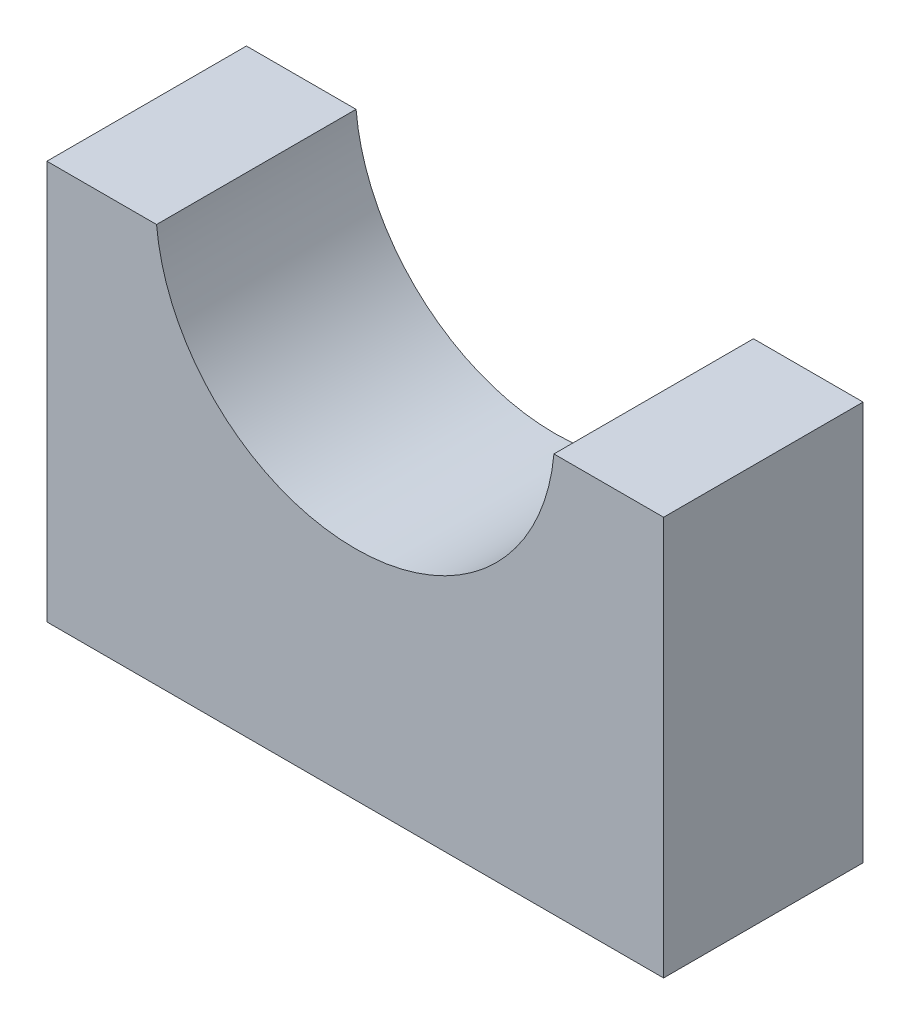
ISO-10303-21;
HEADER;
FILE_DESCRIPTION(('STEP AP214'),'2;1');
FILE_NAME('part.step','',(''),(''),'','','');
FILE_SCHEMA(('AUTOMOTIVE_DESIGN { 1 0 10303 214 1 1 1 1 }'));
ENDSEC;
DATA;
#1=APPLICATION_CONTEXT('core data for automotive mechanical design processes');
#2=APPLICATION_PROTOCOL_DEFINITION('international standard','automotive_design',2000,#1);
#3=PRODUCT_CONTEXT('',#1,'mechanical');
#4=PRODUCT('Part','Part','',(#3));
#5=PRODUCT_RELATED_PRODUCT_CATEGORY('part','',(#4));
#6=PRODUCT_DEFINITION_FORMATION('','',#4);
#7=PRODUCT_DEFINITION_CONTEXT('part definition',#1,'design');
#8=PRODUCT_DEFINITION('design','',#6,#7);
#9=PRODUCT_DEFINITION_SHAPE('','',#8);
#10=(LENGTH_UNIT() NAMED_UNIT(*) SI_UNIT(.MILLI.,.METRE.));
#11=(NAMED_UNIT(*) PLANE_ANGLE_UNIT() SI_UNIT($,.RADIAN.));
#12=(NAMED_UNIT(*) SI_UNIT($,.STERADIAN.) SOLID_ANGLE_UNIT());
#13=UNCERTAINTY_MEASURE_WITH_UNIT(LENGTH_MEASURE(1.E-05),#10,'distance_accuracy_value','');
#14=(GEOMETRIC_REPRESENTATION_CONTEXT(3) GLOBAL_UNCERTAINTY_ASSIGNED_CONTEXT((#13)) GLOBAL_UNIT_ASSIGNED_CONTEXT((#10,
#11,#12)) REPRESENTATION_CONTEXT('',''));
#15=CARTESIAN_POINT('',(0.,0.,0.));
#16=DIRECTION('',(0.,0.,1.));
#17=DIRECTION('',(1.,0.,0.));
#18=AXIS2_PLACEMENT_3D('',#15,#16,#17);
#19=CARTESIAN_POINT('',(0.,0.,11.));
#20=DIRECTION('',(0.,0.,-1.));
#21=DIRECTION('',(-1.,0.,0.));
#22=AXIS2_PLACEMENT_3D('',#19,#20,#21);
#23=CYLINDRICAL_SURFACE('',#22,11.);
#24=CARTESIAN_POINT('',(0.,0.,0.));
#25=DIRECTION('',(0.,0.,1.));
#26=DIRECTION('',(1.,0.,0.));
#27=AXIS2_PLACEMENT_3D('',#24,#25,#26);
#28=CIRCLE('',#27,11.);
#29=CARTESIAN_POINT('',(-10.9544511501033,-1.,0.));
#30=VERTEX_POINT('',#29);
#31=CARTESIAN_POINT('',(10.9544511501033,-1.,0.));
#32=VERTEX_POINT('',#31);
#33=EDGE_CURVE('E118',#30,#32,#28,.T.);
#34=ORIENTED_EDGE('',*,*,#33,.F.);
#35=DIRECTION('',(0.,0.,-1.));
#36=VECTOR('',#35,1.);
#37=CARTESIAN_POINT('',(-10.9544511501033,-1.,11.));
#38=LINE('',#37,#36);
#39=CARTESIAN_POINT('',(-10.9544511501033,-1.,11.));
#40=VERTEX_POINT('',#39);
#41=EDGE_CURVE('E11',#40,#30,#38,.T.);
#42=ORIENTED_EDGE('',*,*,#41,.F.);
#43=CARTESIAN_POINT('',(0.,0.,11.));
#44=DIRECTION('',(0.,0.,1.));
#45=DIRECTION('',(1.,0.,0.));
#46=AXIS2_PLACEMENT_3D('',#43,#44,#45);
#47=CIRCLE('',#46,11.);
#48=CARTESIAN_POINT('',(10.9544511501033,-1.,11.));
#49=VERTEX_POINT('',#48);
#50=EDGE_CURVE('E142',#40,#49,#47,.T.);
#51=ORIENTED_EDGE('',*,*,#50,.T.);
#52=DIRECTION('',(0.,0.,-1.));
#53=VECTOR('',#52,1.);
#54=CARTESIAN_POINT('',(10.9544511501033,-1.,11.));
#55=LINE('',#54,#53);
#56=EDGE_CURVE('E51',#49,#32,#55,.T.);
#57=ORIENTED_EDGE('',*,*,#56,.T.);
#58=EDGE_LOOP('',(#34,#42,#51,#57));
#59=FACE_BOUND('',#58,.T.);
#60=ADVANCED_FACE('F35',(#59),#23,.F.);
#61=CARTESIAN_POINT('',(0.,-1.,11.));
#62=DIRECTION('',(0.,1.,0.));
#63=DIRECTION('',(0.,0.,1.));
#64=AXIS2_PLACEMENT_3D('',#61,#62,#63);
#65=PLANE('',#64);
#66=DIRECTION('',(1.,0.,0.));
#67=VECTOR('',#66,1.);
#68=CARTESIAN_POINT('',(0.,-1.,0.));
#69=LINE('',#68,#67);
#70=CARTESIAN_POINT('',(-17.,-1.,0.));
#71=VERTEX_POINT('',#70);
#72=EDGE_CURVE('E120',#71,#30,#69,.T.);
#73=ORIENTED_EDGE('',*,*,#72,.F.);
#74=DIRECTION('',(0.,0.,-1.));
#75=VECTOR('',#74,1.);
#76=CARTESIAN_POINT('',(-17.,-1.,11.));
#77=LINE('',#76,#75);
#78=CARTESIAN_POINT('',(-17.,-1.,11.));
#79=VERTEX_POINT('',#78);
#80=EDGE_CURVE('E43',#79,#71,#77,.T.);
#81=ORIENTED_EDGE('',*,*,#80,.F.);
#82=DIRECTION('',(1.,0.,0.));
#83=VECTOR('',#82,1.);
#84=CARTESIAN_POINT('',(0.,-1.,11.));
#85=LINE('',#84,#83);
#86=EDGE_CURVE('E115',#79,#40,#85,.T.);
#87=ORIENTED_EDGE('',*,*,#86,.T.);
#88=ORIENTED_EDGE('',*,*,#41,.T.);
#89=EDGE_LOOP('',(#73,#81,#87,#88));
#90=FACE_BOUND('',#89,.T.);
#91=ADVANCED_FACE('F139',(#90),#65,.T.);
#92=CARTESIAN_POINT('',(-17.,0.,11.));
#93=DIRECTION('',(1.,0.,0.));
#94=DIRECTION('',(0.,1.,0.));
#95=AXIS2_PLACEMENT_3D('',#92,#93,#94);
#96=PLANE('',#95);
#97=DIRECTION('',(0.,-1.,0.));
#98=VECTOR('',#97,1.);
#99=CARTESIAN_POINT('',(-17.,0.,0.));
#100=LINE('',#99,#98);
#101=CARTESIAN_POINT('',(-17.,-23.,0.));
#102=VERTEX_POINT('',#101);
#103=EDGE_CURVE('E123',#71,#102,#100,.T.);
#104=ORIENTED_EDGE('',*,*,#103,.T.);
#105=DIRECTION('',(0.,0.,-1.));
#106=VECTOR('',#105,1.);
#107=CARTESIAN_POINT('',(-17.,-23.,11.));
#108=LINE('',#107,#106);
#109=CARTESIAN_POINT('',(-17.,-23.,11.));
#110=VERTEX_POINT('',#109);
#111=EDGE_CURVE('E109',#110,#102,#108,.T.);
#112=ORIENTED_EDGE('',*,*,#111,.F.);
#113=DIRECTION('',(0.,-1.,0.));
#114=VECTOR('',#113,1.);
#115=CARTESIAN_POINT('',(-17.,0.,11.));
#116=LINE('',#115,#114);
#117=EDGE_CURVE('E97',#79,#110,#116,.T.);
#118=ORIENTED_EDGE('',*,*,#117,.F.);
#119=ORIENTED_EDGE('',*,*,#80,.T.);
#120=EDGE_LOOP('',(#104,#112,#118,#119));
#121=FACE_BOUND('',#120,.T.);
#122=ADVANCED_FACE('F133',(#121),#96,.F.);
#123=CARTESIAN_POINT('',(0.,-23.,11.));
#124=DIRECTION('',(0.,1.,0.));
#125=DIRECTION('',(-1.,0.,0.));
#126=AXIS2_PLACEMENT_3D('',#123,#124,#125);
#127=PLANE('',#126);
#128=DIRECTION('',(1.,0.,0.));
#129=VECTOR('',#128,1.);
#130=CARTESIAN_POINT('',(0.,-23.,0.));
#131=LINE('',#130,#129);
#132=CARTESIAN_POINT('',(17.,-23.,0.));
#133=VERTEX_POINT('',#132);
#134=EDGE_CURVE('E106',#102,#133,#131,.T.);
#135=ORIENTED_EDGE('',*,*,#134,.T.);
#136=DIRECTION('',(0.,0.,-1.));
#137=VECTOR('',#136,1.);
#138=CARTESIAN_POINT('',(17.,-23.,11.));
#139=LINE('',#138,#137);
#140=CARTESIAN_POINT('',(17.,-23.,11.));
#141=VERTEX_POINT('',#140);
#142=EDGE_CURVE('E103',#141,#133,#139,.T.);
#143=ORIENTED_EDGE('',*,*,#142,.F.);
#144=DIRECTION('',(1.,0.,0.));
#145=VECTOR('',#144,1.);
#146=CARTESIAN_POINT('',(0.,-23.,11.));
#147=LINE('',#146,#145);
#148=EDGE_CURVE('E89',#110,#141,#147,.T.);
#149=ORIENTED_EDGE('',*,*,#148,.F.);
#150=ORIENTED_EDGE('',*,*,#111,.T.);
#151=EDGE_LOOP('',(#135,#143,#149,#150));
#152=FACE_BOUND('',#151,.T.);
#153=ADVANCED_FACE('F104',(#152),#127,.F.);
#154=CARTESIAN_POINT('',(17.,0.,11.));
#155=DIRECTION('',(-1.,0.,0.));
#156=DIRECTION('',(0.,0.,1.));
#157=AXIS2_PLACEMENT_3D('',#154,#155,#156);
#158=PLANE('',#157);
#159=DIRECTION('',(0.,1.,0.));
#160=VECTOR('',#159,1.);
#161=CARTESIAN_POINT('',(17.,0.,0.));
#162=LINE('',#161,#160);
#163=CARTESIAN_POINT('',(17.,-1.,0.));
#164=VERTEX_POINT('',#163);
#165=EDGE_CURVE('E127',#133,#164,#162,.T.);
#166=ORIENTED_EDGE('',*,*,#165,.T.);
#167=DIRECTION('',(0.,0.,-1.));
#168=VECTOR('',#167,1.);
#169=CARTESIAN_POINT('',(17.,-1.,11.));
#170=LINE('',#169,#168);
#171=CARTESIAN_POINT('',(17.,-1.,11.));
#172=VERTEX_POINT('',#171);
#173=EDGE_CURVE('E71',#172,#164,#170,.T.);
#174=ORIENTED_EDGE('',*,*,#173,.F.);
#175=DIRECTION('',(0.,1.,0.));
#176=VECTOR('',#175,1.);
#177=CARTESIAN_POINT('',(17.,0.,11.));
#178=LINE('',#177,#176);
#179=EDGE_CURVE('E94',#141,#172,#178,.T.);
#180=ORIENTED_EDGE('',*,*,#179,.F.);
#181=ORIENTED_EDGE('',*,*,#142,.T.);
#182=EDGE_LOOP('',(#166,#174,#180,#181));
#183=FACE_BOUND('',#182,.T.);
#184=ADVANCED_FACE('F111',(#183),#158,.F.);
#185=EDGE_CURVE('E124',#32,#164,#69,.T.);
#186=ORIENTED_EDGE('',*,*,#185,.F.);
#187=ORIENTED_EDGE('',*,*,#56,.F.);
#188=EDGE_CURVE('E112',#49,#172,#85,.T.);
#189=ORIENTED_EDGE('',*,*,#188,.T.);
#190=ORIENTED_EDGE('',*,*,#173,.T.);
#191=EDGE_LOOP('',(#186,#187,#189,#190));
#192=FACE_BOUND('',#191,.T.);
#193=ADVANCED_FACE('F141',(#192),#65,.T.);
#194=CARTESIAN_POINT('',(0.,0.,11.));
#195=DIRECTION('',(0.,0.,1.));
#196=DIRECTION('',(1.,0.,0.));
#197=AXIS2_PLACEMENT_3D('',#194,#195,#196);
#198=PLANE('',#197);
#199=ORIENTED_EDGE('',*,*,#50,.F.);
#200=ORIENTED_EDGE('',*,*,#86,.F.);
#201=ORIENTED_EDGE('',*,*,#117,.T.);
#202=ORIENTED_EDGE('',*,*,#148,.T.);
#203=ORIENTED_EDGE('',*,*,#179,.T.);
#204=ORIENTED_EDGE('',*,*,#188,.F.);
#205=EDGE_LOOP('',(#199,#200,#201,#202,#203,#204));
#206=FACE_BOUND('',#205,.T.);
#207=ADVANCED_FACE('F91',(#206),#198,.T.);
#208=CARTESIAN_POINT('',(0.,0.,0.));
#209=DIRECTION('',(0.,0.,1.));
#210=DIRECTION('',(1.,0.,0.));
#211=AXIS2_PLACEMENT_3D('',#208,#209,#210);
#212=PLANE('',#211);
#213=ORIENTED_EDGE('',*,*,#33,.T.);
#214=ORIENTED_EDGE('',*,*,#185,.T.);
#215=ORIENTED_EDGE('',*,*,#165,.F.);
#216=ORIENTED_EDGE('',*,*,#134,.F.);
#217=ORIENTED_EDGE('',*,*,#103,.F.);
#218=ORIENTED_EDGE('',*,*,#72,.T.);
#219=EDGE_LOOP('',(#213,#214,#215,#216,#217,#218));
#220=FACE_BOUND('',#219,.T.);
#221=ADVANCED_FACE('F138',(#220),#212,.F.);
#222=CLOSED_SHELL('',(#60,#91,#122,#153,#184,#193,#207,#221));
#223=MANIFOLD_SOLID_BREP('B2',#222);
#224=ADVANCED_BREP_SHAPE_REPRESENTATION('',(#18,#223),#14);
#225=SHAPE_DEFINITION_REPRESENTATION(#9,#224);
ENDSEC;
END-ISO-10303-21;
